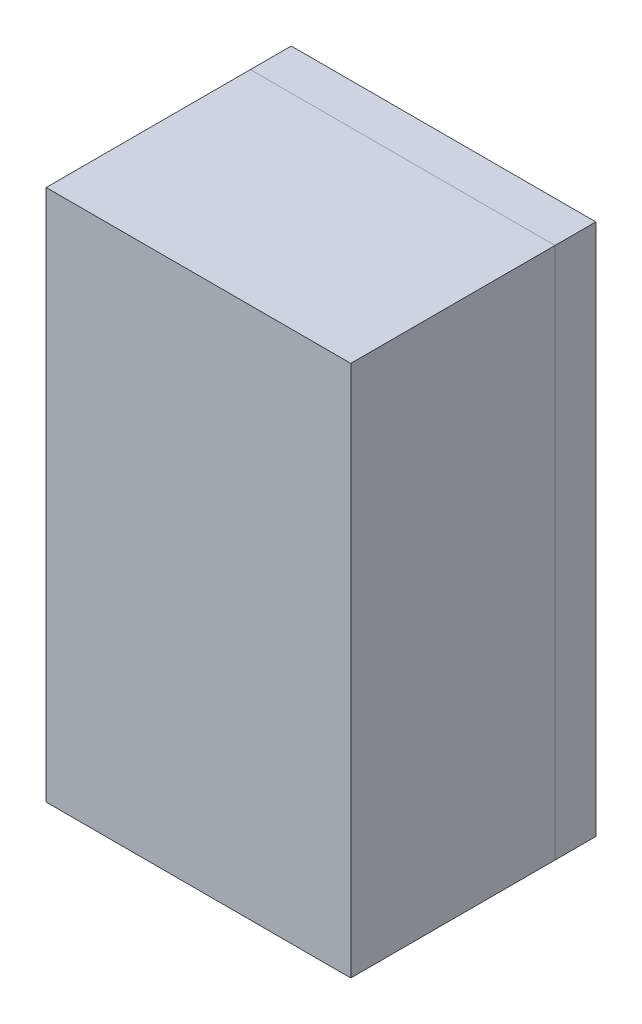
ISO-10303-21;
HEADER;
FILE_DESCRIPTION(('STEP AP214'),'2;1');
FILE_NAME('part.step','',(''),(''),'','','');
FILE_SCHEMA(('AUTOMOTIVE_DESIGN { 1 0 10303 214 1 1 1 1 }'));
ENDSEC;
DATA;
#1=APPLICATION_CONTEXT('core data for automotive mechanical design processes');
#2=APPLICATION_PROTOCOL_DEFINITION('international standard','automotive_design',2000,#1);
#3=PRODUCT_CONTEXT('',#1,'mechanical');
#4=PRODUCT('Part','Part','',(#3));
#5=PRODUCT_RELATED_PRODUCT_CATEGORY('part','',(#4));
#6=PRODUCT_DEFINITION_FORMATION('','',#4);
#7=PRODUCT_DEFINITION_CONTEXT('part definition',#1,'design');
#8=PRODUCT_DEFINITION('design','',#6,#7);
#9=PRODUCT_DEFINITION_SHAPE('','',#8);
#10=(LENGTH_UNIT() NAMED_UNIT(*) SI_UNIT(.MILLI.,.METRE.));
#11=(NAMED_UNIT(*) PLANE_ANGLE_UNIT() SI_UNIT($,.RADIAN.));
#12=(NAMED_UNIT(*) SI_UNIT($,.STERADIAN.) SOLID_ANGLE_UNIT());
#13=UNCERTAINTY_MEASURE_WITH_UNIT(LENGTH_MEASURE(1.E-05),#10,'distance_accuracy_value','');
#14=(GEOMETRIC_REPRESENTATION_CONTEXT(3) GLOBAL_UNCERTAINTY_ASSIGNED_CONTEXT((#13)) GLOBAL_UNIT_ASSIGNED_CONTEXT((#10,
#11,#12)) REPRESENTATION_CONTEXT('',''));
#15=CARTESIAN_POINT('',(0.,0.,0.));
#16=DIRECTION('',(0.,0.,1.));
#17=DIRECTION('',(1.,0.,0.));
#18=AXIS2_PLACEMENT_3D('',#15,#16,#17);
#19=CARTESIAN_POINT('',(0.,0.,-10.));
#20=DIRECTION('',(0.,0.,1.));
#21=DIRECTION('',(1.,0.,0.));
#22=AXIS2_PLACEMENT_3D('',#19,#20,#21);
#23=PLANE('',#22);
#24=DIRECTION('',(0.,1.,0.));
#25=VECTOR('',#24,1.);
#26=CARTESIAN_POINT('',(-8.20364259654161,65.1655844814713,-10.));
#27=LINE('',#26,#25);
#28=CARTESIAN_POINT('',(-8.20364259654161,-65.1655844814711,-10.));
#29=VERTEX_POINT('',#28);
#30=CARTESIAN_POINT('',(-8.20364259654161,65.1655844814713,-10.));
#31=VERTEX_POINT('',#30);
#32=EDGE_CURVE('E252',#29,#31,#27,.T.);
#33=ORIENTED_EDGE('',*,*,#32,.T.);
#34=DIRECTION('',(1.,0.,0.));
#35=VECTOR('',#34,1.);
#36=CARTESIAN_POINT('',(-8.20364259654161,65.1655844814713,-10.));
#37=LINE('',#36,#35);
#38=CARTESIAN_POINT('',(66.3804052670172,65.1655844814713,-10.));
#39=VERTEX_POINT('',#38);
#40=EDGE_CURVE('E240',#31,#39,#37,.T.);
#41=ORIENTED_EDGE('',*,*,#40,.T.);
#42=DIRECTION('',(0.,-1.,0.));
#43=VECTOR('',#42,1.);
#44=CARTESIAN_POINT('',(66.3804052670172,65.1655844814713,-10.));
#45=LINE('',#44,#43);
#46=CARTESIAN_POINT('',(66.3804052670172,-65.1655844814711,-10.));
#47=VERTEX_POINT('',#46);
#48=EDGE_CURVE('E251',#39,#47,#45,.T.);
#49=ORIENTED_EDGE('',*,*,#48,.T.);
#50=DIRECTION('',(-1.,0.,0.));
#51=VECTOR('',#50,1.);
#52=CARTESIAN_POINT('',(-8.20364259654161,-65.1655844814711,-10.));
#53=LINE('',#52,#51);
#54=EDGE_CURVE('E256',#47,#29,#53,.T.);
#55=ORIENTED_EDGE('',*,*,#54,.T.);
#56=EDGE_LOOP('',(#33,#41,#49,#55));
#57=FACE_BOUND('',#56,.T.);
#58=ADVANCED_FACE('F197',(#57),#23,.F.);
#59=CARTESIAN_POINT('',(-8.20364259654161,-65.1655844814711,-10.));
#60=DIRECTION('',(0.,1.,0.));
#61=DIRECTION('',(0.,0.,1.));
#62=AXIS2_PLACEMENT_3D('',#59,#60,#61);
#63=PLANE('',#62);
#64=DIRECTION('',(0.,0.,1.));
#65=VECTOR('',#64,1.);
#66=CARTESIAN_POINT('',(66.3804052670172,-65.1655844814711,-10.));
#67=LINE('',#66,#65);
#68=CARTESIAN_POINT('',(66.3804052670172,-65.1655844814711,0.));
#69=VERTEX_POINT('',#68);
#70=EDGE_CURVE('E262',#47,#69,#67,.T.);
#71=ORIENTED_EDGE('',*,*,#70,.T.);
#72=DIRECTION('',(-1.,0.,0.));
#73=VECTOR('',#72,1.);
#74=CARTESIAN_POINT('',(-8.20364259654161,-65.1655844814711,0.));
#75=LINE('',#74,#73);
#76=CARTESIAN_POINT('',(-8.20364259654161,-65.1655844814711,0.));
#77=VERTEX_POINT('',#76);
#78=EDGE_CURVE('E201',#69,#77,#75,.T.);
#79=ORIENTED_EDGE('',*,*,#78,.T.);
#80=DIRECTION('',(0.,0.,1.));
#81=VECTOR('',#80,1.);
#82=CARTESIAN_POINT('',(-8.20364259654161,-65.1655844814711,-10.));
#83=LINE('',#82,#81);
#84=EDGE_CURVE('E267',#29,#77,#83,.T.);
#85=ORIENTED_EDGE('',*,*,#84,.F.);
#86=ORIENTED_EDGE('',*,*,#54,.F.);
#87=EDGE_LOOP('',(#71,#79,#85,#86));
#88=FACE_BOUND('',#87,.T.);
#89=ADVANCED_FACE('F294',(#88),#63,.F.);
#90=CARTESIAN_POINT('',(66.3804052670172,65.1655844814713,-10.));
#91=DIRECTION('',(-1.,0.,0.));
#92=DIRECTION('',(0.,-1.,0.));
#93=AXIS2_PLACEMENT_3D('',#90,#91,#92);
#94=PLANE('',#93);
#95=DIRECTION('',(0.,0.,1.));
#96=VECTOR('',#95,1.);
#97=CARTESIAN_POINT('',(66.3804052670172,65.1655844814713,-10.));
#98=LINE('',#97,#96);
#99=CARTESIAN_POINT('',(66.3804052670172,65.1655844814713,0.));
#100=VERTEX_POINT('',#99);
#101=EDGE_CURVE('E248',#39,#100,#98,.T.);
#102=ORIENTED_EDGE('',*,*,#101,.T.);
#103=DIRECTION('',(0.,-1.,0.));
#104=VECTOR('',#103,1.);
#105=CARTESIAN_POINT('',(66.3804052670172,65.1655844814713,0.));
#106=LINE('',#105,#104);
#107=EDGE_CURVE('E274',#100,#69,#106,.T.);
#108=ORIENTED_EDGE('',*,*,#107,.T.);
#109=ORIENTED_EDGE('',*,*,#70,.F.);
#110=ORIENTED_EDGE('',*,*,#48,.F.);
#111=EDGE_LOOP('',(#102,#108,#109,#110));
#112=FACE_BOUND('',#111,.T.);
#113=ADVANCED_FACE('F297',(#112),#94,.F.);
#114=CARTESIAN_POINT('',(-8.20364259654161,65.1655844814713,-10.));
#115=DIRECTION('',(0.,-1.,0.));
#116=DIRECTION('',(0.,0.,-1.));
#117=AXIS2_PLACEMENT_3D('',#114,#115,#116);
#118=PLANE('',#117);
#119=DIRECTION('',(0.,0.,1.));
#120=VECTOR('',#119,1.);
#121=CARTESIAN_POINT('',(-8.20364259654161,65.1655844814713,-10.));
#122=LINE('',#121,#120);
#123=CARTESIAN_POINT('',(-8.20364259654161,65.1655844814713,0.));
#124=VERTEX_POINT('',#123);
#125=EDGE_CURVE('E245',#31,#124,#122,.T.);
#126=ORIENTED_EDGE('',*,*,#125,.T.);
#127=DIRECTION('',(1.,0.,0.));
#128=VECTOR('',#127,1.);
#129=CARTESIAN_POINT('',(-8.20364259654161,65.1655844814713,0.));
#130=LINE('',#129,#128);
#131=EDGE_CURVE('E272',#124,#100,#130,.T.);
#132=ORIENTED_EDGE('',*,*,#131,.T.);
#133=ORIENTED_EDGE('',*,*,#101,.F.);
#134=ORIENTED_EDGE('',*,*,#40,.F.);
#135=EDGE_LOOP('',(#126,#132,#133,#134));
#136=FACE_BOUND('',#135,.T.);
#137=ADVANCED_FACE('F242',(#136),#118,.F.);
#138=CARTESIAN_POINT('',(-8.20364259654161,65.1655844814713,-10.));
#139=DIRECTION('',(1.,0.,0.));
#140=DIRECTION('',(0.,0.,-1.));
#141=AXIS2_PLACEMENT_3D('',#138,#139,#140);
#142=PLANE('',#141);
#143=ORIENTED_EDGE('',*,*,#84,.T.);
#144=DIRECTION('',(0.,1.,0.));
#145=VECTOR('',#144,1.);
#146=CARTESIAN_POINT('',(-8.20364259654161,65.1655844814713,0.));
#147=LINE('',#146,#145);
#148=EDGE_CURVE('E261',#77,#124,#147,.T.);
#149=ORIENTED_EDGE('',*,*,#148,.T.);
#150=ORIENTED_EDGE('',*,*,#125,.F.);
#151=ORIENTED_EDGE('',*,*,#32,.F.);
#152=EDGE_LOOP('',(#143,#149,#150,#151));
#153=FACE_BOUND('',#152,.T.);
#154=ADVANCED_FACE('F199',(#153),#142,.F.);
#155=CARTESIAN_POINT('',(0.,-61.4859505383657,0.));
#156=DIRECTION('',(0.,0.,-1.));
#157=DIRECTION('',(0.,1.,0.));
#158=AXIS2_PLACEMENT_3D('',#155,#156,#157);
#159=PLANE('',#158);
#160=CARTESIAN_POINT('',(0.,-61.4859505383657,0.));
#161=CARTESIAN_POINT('',(3.02036043110576,-61.4859505383657,0.));
#162=CARTESIAN_POINT('',(6.02667704221539,-61.1898788807037,0.));
#163=CARTESIAN_POINT('',(9.0322478441245,-60.8938806727128,0.));
#164=CARTESIAN_POINT('',(11.9953138899975,-60.3045152396302,0.));
#165=CARTESIAN_POINT('',(14.9573991489904,-59.7153448888966,0.));
#166=CARTESIAN_POINT('',(17.8484293077134,-58.8383861509977,0.));
#167=CARTESIAN_POINT('',(20.7385025235864,-57.9617176900409,0.));
#168=CARTESIAN_POINT('',(23.529654594252,-56.8056112393974,0.));
#169=CARTESIAN_POINT('',(26.3198827821434,-55.6498874647271,0.));
#170=CARTESIAN_POINT('',(28.9842764444303,-54.2257672384559,0.));
#171=CARTESIAN_POINT('',(31.6477881817085,-52.8021184017023,0.));
#172=CARTESIAN_POINT('',(34.1597638680316,-51.1236994561885,0.));
#173=CARTESIAN_POINT('',(36.6709080804607,-49.4458360739884,0.));
#174=CARTESIAN_POINT('',(39.0062740919573,-47.529282501101,0.));
#175=CARTESIAN_POINT('',(41.3408670879488,-45.6133633151238,0.));
#176=CARTESIAN_POINT('',(43.4771325733791,-43.4771325733791,0.));
#177=CARTESIAN_POINT('',(45.6126909462167,-41.3416089327268,0.));
#178=CARTESIAN_POINT('',(47.5292825011009,-39.0062740919573,0.));
#179=CARTESIAN_POINT('',(49.4452396564477,-36.6717122564425,0.));
#180=CARTESIAN_POINT('',(51.1236994561884,-34.1597638680316,0.));
#181=CARTESIAN_POINT('',(52.801603679256,-31.6486469442344,0.));
#182=CARTESIAN_POINT('',(54.2257672384559,-28.9842764444303,0.));
#183=CARTESIAN_POINT('',(55.649459394032,-26.3207878615247,0.));
#184=CARTESIAN_POINT('',(56.8056112393974,-23.529654594252,0.));
#185=CARTESIAN_POINT('',(57.9613803937807,-20.739445203489,0.));
#186=CARTESIAN_POINT('',(58.8383861509977,-17.8484293077134,0.));
#187=CARTESIAN_POINT('',(59.7151016156553,-14.9583703502441,0.));
#188=CARTESIAN_POINT('',(60.3045152396302,-11.9953138899975,0.));
#189=CARTESIAN_POINT('',(60.8937337653028,-9.0332382134683,0.));
#190=CARTESIAN_POINT('',(61.1898788807037,-6.02667704221541,0.));
#191=CARTESIAN_POINT('',(61.4859259708732,-3.02111105487498,0.));
#192=CARTESIAN_POINT('',(61.4859505383657,0.,0.));
#193=CARTESIAN_POINT('',(61.4859750977263,3.02011105471781,0.));
#194=CARTESIAN_POINT('',(61.1898788807037,6.0266770422154,0.));
#195=CARTESIAN_POINT('',(60.8938806727508,9.03224784396524,0.));
#196=CARTESIAN_POINT('',(60.3045152396302,11.9953138899975,0.));
#197=CARTESIAN_POINT('',(59.7153448888506,14.9573991491901,0.));
#198=CARTESIAN_POINT('',(58.8383861509977,17.8484293077134,0.));
#199=CARTESIAN_POINT('',(57.9617176899982,20.7385025236791,0.));
#200=CARTESIAN_POINT('',(56.8056112393974,23.529654594252,0.));
#201=CARTESIAN_POINT('',(55.6498874647079,26.3198827822003,0.));
#202=CARTESIAN_POINT('',(54.2257672384559,28.9842764444303,0.));
#203=CARTESIAN_POINT('',(52.8021184015903,31.6477881818971,0.));
#204=CARTESIAN_POINT('',(51.1236994561884,34.1597638680316,0.));
#205=CARTESIAN_POINT('',(49.445836073913,36.6709080805525,0.));
#206=CARTESIAN_POINT('',(47.529282501101,39.0062740919573,0.));
#207=CARTESIAN_POINT('',(45.6133633151238,41.3408670879488,0.));
#208=CARTESIAN_POINT('',(43.4771325733791,43.4771325733791,0.));
#209=CARTESIAN_POINT('',(41.3416089327268,45.6126909462167,0.));
#210=CARTESIAN_POINT('',(39.0062740919573,47.529282501101,0.));
#211=CARTESIAN_POINT('',(36.6717122564424,49.4452396564477,0.));
#212=CARTESIAN_POINT('',(34.1597638680316,51.1236994561884,0.));
#213=CARTESIAN_POINT('',(31.6486469444331,52.8016036791232,0.));
#214=CARTESIAN_POINT('',(28.9842764444303,54.2257672384559,0.));
#215=CARTESIAN_POINT('',(26.320787861361,55.6494593941461,0.));
#216=CARTESIAN_POINT('',(23.529654594252,56.8056112393974,0.));
#217=CARTESIAN_POINT('',(20.7394452028539,57.9613803939974,0.));
#218=CARTESIAN_POINT('',(17.8484293077134,58.8383861509977,0.));
#219=CARTESIAN_POINT('',(14.9583703504243,59.7151016155764,0.));
#220=CARTESIAN_POINT('',(11.9953138899975,60.3045152396302,0.));
#221=CARTESIAN_POINT('',(9.03323821390382,60.8937337652591,0.));
#222=CARTESIAN_POINT('',(6.0266770422154,61.1898788807037,0.));
#223=CARTESIAN_POINT('',(3.02086163773821,61.4859505383658,0.));
#224=CARTESIAN_POINT('',(0.,61.4859505383658,0.));
#225=B_SPLINE_CURVE_WITH_KNOTS('',2,(#160,#161,#162,#163,#164,#165,#166,#167,#168,#169,#170,
#171,#172,#173,#174,#175,#176,#177,#178,#179,#180,#181,#182,#183,#184,#185,#186,#187,#188,#189,
#190,#191,#192,#193,#194,#195,#196,#197,#198,#199,#200,#201,#202,#203,#204,#205,#206,#207,#208,
#209,#210,#211,#212,#213,#214,#215,#216,#217,#218,#219,#220,#221,#222,#223,#224),.UNSPECIFIED.,
.F.,.F.,(3,2,2,2,2,2,2,2,2,2,2,2,2,2,2,2,2,2,2,2,2,2,2,2,2,2,2,2,2,2,2,2,3),(0.,0.03125,0.0625,
0.09375,0.125,0.15625,0.1875,0.21875,0.25,0.28125,0.3125,0.34375,0.375,0.40625,0.4375,0.46875,
0.5,0.53125,0.5625,0.59375,0.625,0.65625,0.6875,0.71875,0.75,0.78125,0.8125,0.84375,0.875,
0.90625,0.9375,0.96875,1.),.UNSPECIFIED.);
#226=CARTESIAN_POINT('',(0.,-61.4859505383657,0.));
#227=VERTEX_POINT('',#226);
#228=CARTESIAN_POINT('',(0.,61.4859505383658,0.));
#229=VERTEX_POINT('',#228);
#230=EDGE_CURVE('E208',#227,#229,#225,.T.);
#231=ORIENTED_EDGE('',*,*,#230,.F.);
#232=DIRECTION('',(0.,-1.,0.));
#233=VECTOR('',#232,1.);
#234=CARTESIAN_POINT('',(0.,61.4859505383657,0.));
#235=LINE('',#234,#233);
#236=EDGE_CURVE('E14',#229,#227,#235,.T.);
#237=ORIENTED_EDGE('',*,*,#236,.F.);
#238=EDGE_LOOP('',(#231,#237));
#239=FACE_BOUND('',#238,.T.);
#240=ORIENTED_EDGE('',*,*,#78,.F.);
#241=ORIENTED_EDGE('',*,*,#107,.F.);
#242=ORIENTED_EDGE('',*,*,#131,.F.);
#243=ORIENTED_EDGE('',*,*,#148,.F.);
#244=EDGE_LOOP('',(#240,#241,#242,#243));
#245=FACE_BOUND('',#244,.T.);
#246=ADVANCED_FACE('F280',(#239,#245),#159,.F.);
#247=CARTESIAN_POINT('',(0.,0.,0.));
#248=DIRECTION('',(0.,0.,1.));
#249=DIRECTION('',(1.,0.,0.));
#250=AXIS2_PLACEMENT_3D('',#247,#248,#249);
#251=PLANE('',#250);
#252=ORIENTED_EDGE('',*,*,#230,.T.);
#253=ORIENTED_EDGE('',*,*,#236,.T.);
#254=EDGE_LOOP('',(#252,#253));
#255=FACE_BOUND('',#254,.T.);
#256=ADVANCED_FACE('F290',(#255),#251,.T.);
#257=CLOSED_SHELL('',(#58,#89,#113,#137,#154,#246,#256));
#258=MANIFOLD_SOLID_BREP('B2',#257);
#259=CARTESIAN_POINT('',(-8.20364259654161,65.1655844814713,-10.));
#260=DIRECTION('',(1.,0.,0.));
#261=DIRECTION('',(0.,0.,-1.));
#262=AXIS2_PLACEMENT_3D('',#259,#260,#261);
#263=PLANE('',#262);
#264=DIRECTION('',(0.,1.,0.));
#265=VECTOR('',#264,1.);
#266=CARTESIAN_POINT('',(-8.20364259654161,65.1655844814713,0.));
#267=LINE('',#266,#265);
#268=CARTESIAN_POINT('',(-8.20364259654161,-65.1655844814711,0.));
#269=VERTEX_POINT('',#268);
#270=CARTESIAN_POINT('',(-8.20364259654161,65.1655844814713,0.));
#271=VERTEX_POINT('',#270);
#272=EDGE_CURVE('E410',#269,#271,#267,.T.);
#273=ORIENTED_EDGE('',*,*,#272,.F.);
#274=DIRECTION('',(0.,0.,1.));
#275=VECTOR('',#274,1.);
#276=CARTESIAN_POINT('',(-8.20364259654161,-65.1655844814711,-10.));
#277=LINE('',#276,#275);
#278=CARTESIAN_POINT('',(-8.20364259654161,-65.1655844814711,50.));
#279=VERTEX_POINT('',#278);
#280=EDGE_CURVE('E465',#269,#279,#277,.T.);
#281=ORIENTED_EDGE('',*,*,#280,.T.);
#282=DIRECTION('',(0.,1.,0.));
#283=VECTOR('',#282,1.);
#284=CARTESIAN_POINT('',(-8.20364259654161,65.1655844814713,50.));
#285=LINE('',#284,#283);
#286=CARTESIAN_POINT('',(-8.20364259654161,65.1655844814713,50.));
#287=VERTEX_POINT('',#286);
#288=EDGE_CURVE('E460',#279,#287,#285,.T.);
#289=ORIENTED_EDGE('',*,*,#288,.T.);
#290=DIRECTION('',(0.,0.,1.));
#291=VECTOR('',#290,1.);
#292=CARTESIAN_POINT('',(-8.20364259654161,65.1655844814713,-10.));
#293=LINE('',#292,#291);
#294=EDGE_CURVE('E446',#271,#287,#293,.T.);
#295=ORIENTED_EDGE('',*,*,#294,.F.);
#296=EDGE_LOOP('',(#273,#281,#289,#295));
#297=FACE_BOUND('',#296,.T.);
#298=ADVANCED_FACE('F392',(#297),#263,.F.);
#299=CARTESIAN_POINT('',(-8.20364259654161,65.1655844814713,-10.));
#300=DIRECTION('',(0.,-1.,0.));
#301=DIRECTION('',(0.,0.,-1.));
#302=AXIS2_PLACEMENT_3D('',#299,#300,#301);
#303=PLANE('',#302);
#304=DIRECTION('',(1.,0.,0.));
#305=VECTOR('',#304,1.);
#306=CARTESIAN_POINT('',(-8.20364259654161,65.1655844814713,0.));
#307=LINE('',#306,#305);
#308=CARTESIAN_POINT('',(66.3804052670172,65.1655844814713,0.));
#309=VERTEX_POINT('',#308);
#310=EDGE_CURVE('E452',#271,#309,#307,.T.);
#311=ORIENTED_EDGE('',*,*,#310,.F.);
#312=ORIENTED_EDGE('',*,*,#294,.T.);
#313=DIRECTION('',(1.,0.,0.));
#314=VECTOR('',#313,1.);
#315=CARTESIAN_POINT('',(-8.20364259654161,65.1655844814713,50.));
#316=LINE('',#315,#314);
#317=CARTESIAN_POINT('',(66.3804052670172,65.1655844814713,50.));
#318=VERTEX_POINT('',#317);
#319=EDGE_CURVE('E450',#287,#318,#316,.T.);
#320=ORIENTED_EDGE('',*,*,#319,.T.);
#321=DIRECTION('',(0.,0.,1.));
#322=VECTOR('',#321,1.);
#323=CARTESIAN_POINT('',(66.3804052670172,65.1655844814713,-10.));
#324=LINE('',#323,#322);
#325=EDGE_CURVE('E455',#309,#318,#324,.T.);
#326=ORIENTED_EDGE('',*,*,#325,.F.);
#327=EDGE_LOOP('',(#311,#312,#320,#326));
#328=FACE_BOUND('',#327,.T.);
#329=ADVANCED_FACE('F448',(#328),#303,.F.);
#330=CARTESIAN_POINT('',(66.3804052670172,65.1655844814713,-10.));
#331=DIRECTION('',(-1.,0.,0.));
#332=DIRECTION('',(0.,-1.,0.));
#333=AXIS2_PLACEMENT_3D('',#330,#331,#332);
#334=PLANE('',#333);
#335=DIRECTION('',(0.,-1.,0.));
#336=VECTOR('',#335,1.);
#337=CARTESIAN_POINT('',(66.3804052670172,65.1655844814713,0.));
#338=LINE('',#337,#336);
#339=CARTESIAN_POINT('',(66.3804052670172,-65.1655844814711,0.));
#340=VERTEX_POINT('',#339);
#341=EDGE_CURVE('E430',#309,#340,#338,.T.);
#342=ORIENTED_EDGE('',*,*,#341,.F.);
#343=ORIENTED_EDGE('',*,*,#325,.T.);
#344=DIRECTION('',(0.,-1.,0.));
#345=VECTOR('',#344,1.);
#346=CARTESIAN_POINT('',(66.3804052670172,65.1655844814713,50.));
#347=LINE('',#346,#345);
#348=CARTESIAN_POINT('',(66.3804052670172,-65.1655844814711,50.));
#349=VERTEX_POINT('',#348);
#350=EDGE_CURVE('E462',#318,#349,#347,.T.);
#351=ORIENTED_EDGE('',*,*,#350,.T.);
#352=DIRECTION('',(0.,0.,1.));
#353=VECTOR('',#352,1.);
#354=CARTESIAN_POINT('',(66.3804052670172,-65.1655844814711,-10.));
#355=LINE('',#354,#353);
#356=EDGE_CURVE('E475',#340,#349,#355,.T.);
#357=ORIENTED_EDGE('',*,*,#356,.F.);
#358=EDGE_LOOP('',(#342,#343,#351,#357));
#359=FACE_BOUND('',#358,.T.);
#360=ADVANCED_FACE('F478',(#359),#334,.F.);
#361=CARTESIAN_POINT('',(-8.20364259654161,-65.1655844814711,-10.));
#362=DIRECTION('',(0.,1.,0.));
#363=DIRECTION('',(0.,0.,1.));
#364=AXIS2_PLACEMENT_3D('',#361,#362,#363);
#365=PLANE('',#364);
#366=DIRECTION('',(-1.,0.,0.));
#367=VECTOR('',#366,1.);
#368=CARTESIAN_POINT('',(-8.20364259654161,-65.1655844814711,0.));
#369=LINE('',#368,#367);
#370=EDGE_CURVE('E395',#340,#269,#369,.T.);
#371=ORIENTED_EDGE('',*,*,#370,.F.);
#372=ORIENTED_EDGE('',*,*,#356,.T.);
#373=DIRECTION('',(-1.,0.,0.));
#374=VECTOR('',#373,1.);
#375=CARTESIAN_POINT('',(-8.20364259654161,-65.1655844814711,50.));
#376=LINE('',#375,#374);
#377=EDGE_CURVE('E472',#349,#279,#376,.T.);
#378=ORIENTED_EDGE('',*,*,#377,.T.);
#379=ORIENTED_EDGE('',*,*,#280,.F.);
#380=EDGE_LOOP('',(#371,#372,#378,#379));
#381=FACE_BOUND('',#380,.T.);
#382=ADVANCED_FACE('F497',(#381),#365,.F.);
#383=CARTESIAN_POINT('',(0.,0.,50.));
#384=DIRECTION('',(0.,0.,1.));
#385=DIRECTION('',(1.,0.,0.));
#386=AXIS2_PLACEMENT_3D('',#383,#384,#385);
#387=PLANE('',#386);
#388=ORIENTED_EDGE('',*,*,#288,.F.);
#389=ORIENTED_EDGE('',*,*,#377,.F.);
#390=ORIENTED_EDGE('',*,*,#350,.F.);
#391=ORIENTED_EDGE('',*,*,#319,.F.);
#392=EDGE_LOOP('',(#388,#389,#390,#391));
#393=FACE_BOUND('',#392,.T.);
#394=ADVANCED_FACE('F458',(#393),#387,.T.);
#395=CARTESIAN_POINT('',(0.,-61.4859505383657,0.));
#396=DIRECTION('',(0.,0.,-1.));
#397=DIRECTION('',(0.,1.,0.));
#398=AXIS2_PLACEMENT_3D('',#395,#396,#397);
#399=PLANE('',#398);
#400=CARTESIAN_POINT('',(0.,0.,0.));
#401=DIRECTION('',(0.,0.,1.));
#402=DIRECTION('',(1.,0.,0.));
#403=AXIS2_PLACEMENT_3D('',#400,#401,#402);
#404=CIRCLE('',#403,61.4859505383657);
#405=CARTESIAN_POINT('',(0.,-61.4859505383657,0.));
#406=VERTEX_POINT('',#405);
#407=CARTESIAN_POINT('',(0.,61.4859505383657,0.));
#408=VERTEX_POINT('',#407);
#409=EDGE_CURVE('E427',#406,#408,#404,.T.);
#410=ORIENTED_EDGE('',*,*,#409,.T.);
#411=DIRECTION('',(0.,-1.,0.));
#412=VECTOR('',#411,1.);
#413=CARTESIAN_POINT('',(0.,61.4859505383657,0.));
#414=LINE('',#413,#412);
#415=EDGE_CURVE('E401',#408,#406,#414,.T.);
#416=ORIENTED_EDGE('',*,*,#415,.T.);
#417=EDGE_LOOP('',(#410,#416));
#418=FACE_BOUND('',#417,.T.);
#419=ORIENTED_EDGE('',*,*,#272,.T.);
#420=ORIENTED_EDGE('',*,*,#310,.T.);
#421=ORIENTED_EDGE('',*,*,#341,.T.);
#422=ORIENTED_EDGE('',*,*,#370,.T.);
#423=EDGE_LOOP('',(#419,#420,#421,#422));
#424=FACE_BOUND('',#423,.T.);
#425=ADVANCED_FACE('F487',(#418,#424),#399,.T.);
#426=CARTESIAN_POINT('',(0.,0.,0.));
#427=DIRECTION('',(0.,1.,0.));
#428=DIRECTION('',(0.642787609686538,0.,0.766044443118979));
#429=AXIS2_PLACEMENT_3D('',#426,#427,#428);
#430=SPHERICAL_SURFACE('',#429,61.4859505383657);
#431=ORIENTED_EDGE('',*,*,#409,.F.);
#432=CARTESIAN_POINT('',(0.,0.,0.));
#433=DIRECTION('',(-0.766044443118979,0.,0.642787609686538));
#434=DIRECTION('',(0.642787609686538,0.,0.766044443118979));
#435=AXIS2_PLACEMENT_3D('',#432,#433,#434);
#436=CIRCLE('',#435,61.4859505383657);
#437=EDGE_CURVE('E195',#406,#408,#436,.T.);
#438=ORIENTED_EDGE('',*,*,#437,.T.);
#439=EDGE_LOOP('',(#431,#438));
#440=FACE_BOUND('',#439,.T.);
#441=ADVANCED_FACE('F489',(#440),#430,.F.);
#442=CARTESIAN_POINT('',(0.,0.,0.));
#443=DIRECTION('',(-0.766044443118979,0.,0.642787609686538));
#444=DIRECTION('',(0.642787609686538,0.,0.766044443118979));
#445=AXIS2_PLACEMENT_3D('',#442,#443,#444);
#446=PLANE('',#445);
#447=ORIENTED_EDGE('',*,*,#437,.F.);
#448=ORIENTED_EDGE('',*,*,#415,.F.);
#449=EDGE_LOOP('',(#447,#448));
#450=FACE_BOUND('',#449,.T.);
#451=ADVANCED_FACE('F495',(#450),#446,.F.);
#452=CLOSED_SHELL('',(#298,#329,#360,#382,#394,#425,#441,#451));
#453=MANIFOLD_SOLID_BREP('B8',#452);
#454=CARTESIAN_POINT('',(0.,0.,0.));
#455=DIRECTION('',(0.,0.,1.));
#456=DIRECTION('',(1.,0.,0.));
#457=AXIS2_PLACEMENT_3D('',#454,#455,#456);
#458=PLANE('',#457);
#459=CARTESIAN_POINT('',(0.,0.,0.));
#460=DIRECTION('',(0.,0.,1.));
#461=DIRECTION('',(1.,0.,0.));
#462=AXIS2_PLACEMENT_3D('',#459,#460,#461);
#463=CIRCLE('',#462,61.4859505383657);
#464=CARTESIAN_POINT('',(0.,-61.4859505383657,0.));
#465=VERTEX_POINT('',#464);
#466=CARTESIAN_POINT('',(0.,61.4859505383657,0.));
#467=VERTEX_POINT('',#466);
#468=EDGE_CURVE('E705',#465,#467,#463,.T.);
#469=ORIENTED_EDGE('',*,*,#468,.F.);
#470=DIRECTION('',(0.,-1.,0.));
#471=VECTOR('',#470,1.);
#472=CARTESIAN_POINT('',(0.,61.4859505383657,0.));
#473=LINE('',#472,#471);
#474=EDGE_CURVE('E596',#467,#465,#473,.T.);
#475=ORIENTED_EDGE('',*,*,#474,.F.);
#476=EDGE_LOOP('',(#469,#475));
#477=FACE_BOUND('',#476,.T.);
#478=ADVANCED_FACE('F700',(#477),#458,.F.);
#479=OPEN_SHELL('',(#478));
#480=SHELL_BASED_SURFACE_MODEL('B384',(#479));
#481=CARTESIAN_POINT('',(0.,0.,0.));
#482=DIRECTION('',(0.,1.,0.));
#483=DIRECTION('',(0.642787609686538,0.,0.766044443118979));
#484=AXIS2_PLACEMENT_3D('',#481,#482,#483);
#485=SPHERICAL_SURFACE('',#484,61.4859505383657);
#486=CARTESIAN_POINT('',(0.,0.,0.));
#487=DIRECTION('',(0.,0.,1.));
#488=DIRECTION('',(1.,0.,0.));
#489=AXIS2_PLACEMENT_3D('',#486,#487,#488);
#490=CIRCLE('',#489,61.4859505383657);
#491=CARTESIAN_POINT('',(0.,-61.4859505383657,0.));
#492=VERTEX_POINT('',#491);
#493=CARTESIAN_POINT('',(0.,61.4859505383657,0.));
#494=VERTEX_POINT('',#493);
#495=EDGE_CURVE('E698',#492,#494,#490,.T.);
#496=ORIENTED_EDGE('',*,*,#495,.T.);
#497=CARTESIAN_POINT('',(0.,0.,0.));
#498=DIRECTION('',(-0.766044443118979,0.,0.642787609686538));
#499=DIRECTION('',(0.642787609686538,0.,0.766044443118979));
#500=AXIS2_PLACEMENT_3D('',#497,#498,#499);
#501=CIRCLE('',#500,61.4859505383657);
#502=EDGE_CURVE('E752',#492,#494,#501,.T.);
#503=ORIENTED_EDGE('',*,*,#502,.F.);
#504=EDGE_LOOP('',(#496,#503));
#505=FACE_BOUND('',#504,.T.);
#506=ADVANCED_FACE('F741',(#505),#485,.T.);
#507=CARTESIAN_POINT('',(0.,0.,0.));
#508=DIRECTION('',(-0.766044443118979,0.,0.642787609686538));
#509=DIRECTION('',(0.642787609686538,0.,0.766044443118979));
#510=AXIS2_PLACEMENT_3D('',#507,#508,#509);
#511=PLANE('',#510);
#512=ORIENTED_EDGE('',*,*,#502,.T.);
#513=DIRECTION('',(0.,-1.,0.));
#514=VECTOR('',#513,1.);
#515=CARTESIAN_POINT('',(0.,61.4859505383657,0.));
#516=LINE('',#515,#514);
#517=EDGE_CURVE('E747',#494,#492,#516,.T.);
#518=ORIENTED_EDGE('',*,*,#517,.T.);
#519=EDGE_LOOP('',(#512,#518));
#520=FACE_BOUND('',#519,.T.);
#521=ADVANCED_FACE('F756',(#520),#511,.T.);
#522=OPEN_SHELL('',(#506,#521));
#523=SHELL_BASED_SURFACE_MODEL('B590',(#522));
#524=CARTESIAN_POINT('',(0.,0.,0.));
#525=DIRECTION('',(0.,1.,0.));
#526=DIRECTION('',(0.642787609686538,0.,0.766044443118979));
#527=AXIS2_PLACEMENT_3D('',#524,#525,#526);
#528=SPHERICAL_SURFACE('',#527,61.4859505383657);
#529=CARTESIAN_POINT('',(0.,0.,0.));
#530=DIRECTION('',(0.,0.,1.));
#531=DIRECTION('',(1.,0.,0.));
#532=AXIS2_PLACEMENT_3D('',#529,#530,#531);
#533=CIRCLE('',#532,61.4859505383657);
#534=CARTESIAN_POINT('',(0.,-61.4859505383657,0.));
#535=VERTEX_POINT('',#534);
#536=CARTESIAN_POINT('',(0.,61.4859505383657,0.));
#537=VERTEX_POINT('',#536);
#538=EDGE_CURVE('E803',#535,#537,#533,.T.);
#539=ORIENTED_EDGE('',*,*,#538,.T.);
#540=CARTESIAN_POINT('',(0.,0.,0.));
#541=DIRECTION('',(-0.766044443118979,0.,0.642787609686538));
#542=DIRECTION('',(0.642787609686538,0.,0.766044443118979));
#543=AXIS2_PLACEMENT_3D('',#540,#541,#542);
#544=CIRCLE('',#543,61.4859505383657);
#545=EDGE_CURVE('E797',#535,#537,#544,.T.);
#546=ORIENTED_EDGE('',*,*,#545,.F.);
#547=EDGE_LOOP('',(#539,#546));
#548=FACE_BOUND('',#547,.T.);
#549=ADVANCED_FACE('F789',(#548),#528,.T.);
#550=CARTESIAN_POINT('',(0.,0.,0.));
#551=DIRECTION('',(-0.766044443118979,0.,0.642787609686538));
#552=DIRECTION('',(0.642787609686538,0.,0.766044443118979));
#553=AXIS2_PLACEMENT_3D('',#550,#551,#552);
#554=PLANE('',#553);
#555=ORIENTED_EDGE('',*,*,#545,.T.);
#556=DIRECTION('',(0.,-1.,0.));
#557=VECTOR('',#556,1.);
#558=CARTESIAN_POINT('',(0.,61.4859505383657,0.));
#559=LINE('',#558,#557);
#560=EDGE_CURVE('E739',#537,#535,#559,.T.);
#561=ORIENTED_EDGE('',*,*,#560,.T.);
#562=EDGE_LOOP('',(#555,#561));
#563=FACE_BOUND('',#562,.T.);
#564=ADVANCED_FACE('F811',(#563),#554,.T.);
#565=CARTESIAN_POINT('',(0.,0.,0.));
#566=DIRECTION('',(0.,0.,1.));
#567=DIRECTION('',(1.,0.,0.));
#568=AXIS2_PLACEMENT_3D('',#565,#566,#567);
#569=PLANE('',#568);
#570=ORIENTED_EDGE('',*,*,#538,.F.);
#571=ORIENTED_EDGE('',*,*,#560,.F.);
#572=EDGE_LOOP('',(#570,#571));
#573=FACE_BOUND('',#572,.T.);
#574=ADVANCED_FACE('F805',(#573),#569,.F.);
#575=CLOSED_SHELL('',(#549,#564,#574));
#576=MANIFOLD_SOLID_BREP('B692',#575);
#577=ADVANCED_BREP_SHAPE_REPRESENTATION('',(#18,#258,#453,#576),#14);
#578=MANIFOLD_SURFACE_SHAPE_REPRESENTATION('',(#18,#480,#523),#14);
#579=SHAPE_REPRESENTATION('',(#18),#14);
#580=SHAPE_DEFINITION_REPRESENTATION(#9,#579);
#581=SHAPE_REPRESENTATION_RELATIONSHIP('','',#579,#577);
#582=SHAPE_REPRESENTATION_RELATIONSHIP('','',#579,#578);
ENDSEC;
END-ISO-10303-21;
